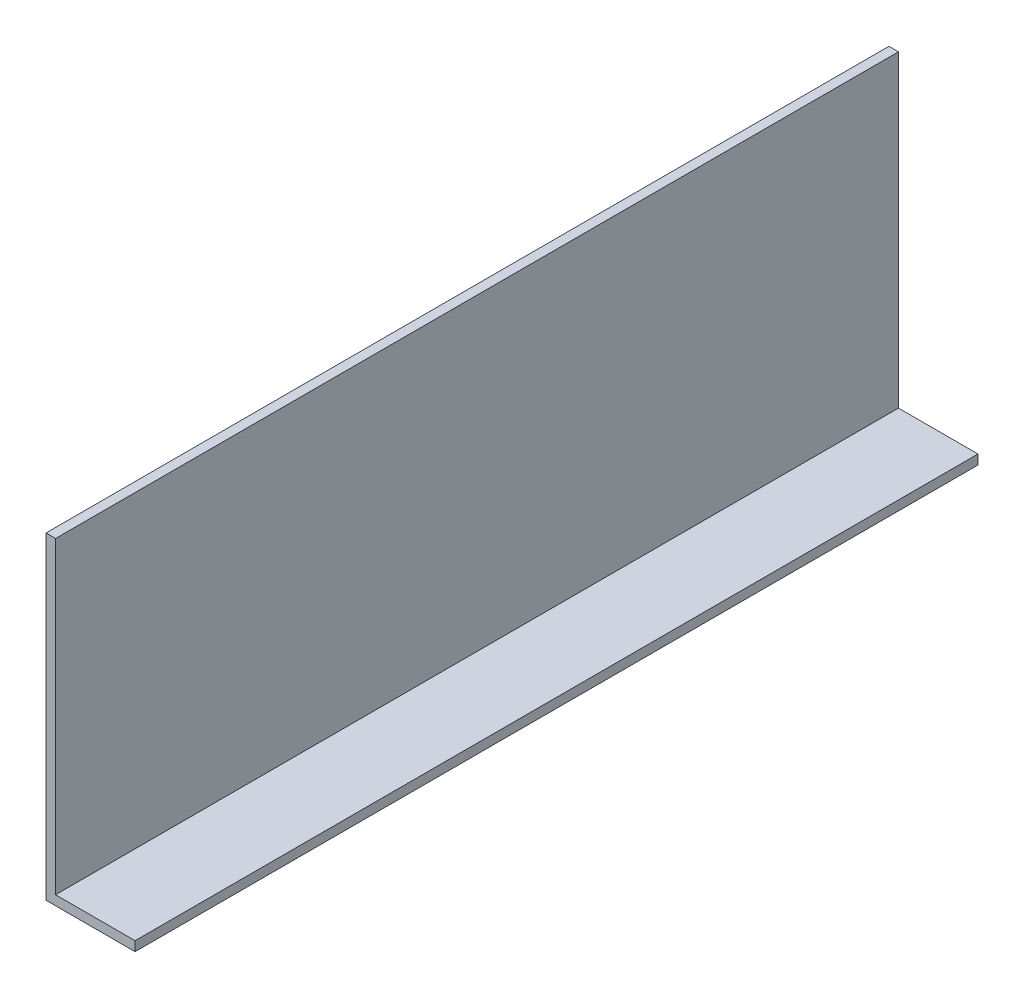
ISO-10303-21;
HEADER;
FILE_DESCRIPTION(('STEP AP214'),'2;1');
FILE_NAME('part.step','',(''),(''),'','','');
FILE_SCHEMA(('AUTOMOTIVE_DESIGN { 1 0 10303 214 1 1 1 1 }'));
ENDSEC;
DATA;
#1=APPLICATION_CONTEXT('core data for automotive mechanical design processes');
#2=APPLICATION_PROTOCOL_DEFINITION('international standard','automotive_design',2000,#1);
#3=PRODUCT_CONTEXT('',#1,'mechanical');
#4=PRODUCT('Part','Part','',(#3));
#5=PRODUCT_RELATED_PRODUCT_CATEGORY('part','',(#4));
#6=PRODUCT_DEFINITION_FORMATION('','',#4);
#7=PRODUCT_DEFINITION_CONTEXT('part definition',#1,'design');
#8=PRODUCT_DEFINITION('design','',#6,#7);
#9=PRODUCT_DEFINITION_SHAPE('','',#8);
#10=(LENGTH_UNIT() NAMED_UNIT(*) SI_UNIT(.MILLI.,.METRE.));
#11=(NAMED_UNIT(*) PLANE_ANGLE_UNIT() SI_UNIT($,.RADIAN.));
#12=(NAMED_UNIT(*) SI_UNIT($,.STERADIAN.) SOLID_ANGLE_UNIT());
#13=UNCERTAINTY_MEASURE_WITH_UNIT(LENGTH_MEASURE(1.E-05),#10,'distance_accuracy_value','');
#14=(GEOMETRIC_REPRESENTATION_CONTEXT(3) GLOBAL_UNCERTAINTY_ASSIGNED_CONTEXT((#13)) GLOBAL_UNIT_ASSIGNED_CONTEXT((#10,
#11,#12)) REPRESENTATION_CONTEXT('',''));
#15=CARTESIAN_POINT('',(0.,0.,0.));
#16=DIRECTION('',(0.,0.,1.));
#17=DIRECTION('',(1.,0.,0.));
#18=AXIS2_PLACEMENT_3D('',#15,#16,#17);
#19=CARTESIAN_POINT('',(3.,100.,265.));
#20=DIRECTION('',(0.,0.,-1.));
#21=DIRECTION('',(0.,1.,0.));
#22=AXIS2_PLACEMENT_3D('',#19,#20,#21);
#23=PLANE('',#22);
#24=DIRECTION('',(0.,-1.,0.));
#25=VECTOR('',#24,1.);
#26=CARTESIAN_POINT('',(-3.,100.,265.));
#27=LINE('',#26,#25);
#28=CARTESIAN_POINT('',(-3.,100.,265.));
#29=VERTEX_POINT('',#28);
#30=CARTESIAN_POINT('',(-3.,-100.,265.));
#31=VERTEX_POINT('',#30);
#32=EDGE_CURVE('E83',#29,#31,#27,.T.);
#33=ORIENTED_EDGE('',*,*,#32,.T.);
#34=DIRECTION('',(-1.,0.,0.));
#35=VECTOR('',#34,1.);
#36=CARTESIAN_POINT('',(3.,-100.,265.));
#37=LINE('',#36,#35);
#38=CARTESIAN_POINT('',(53.,-100.,265.));
#39=VERTEX_POINT('',#38);
#40=EDGE_CURVE('E11',#39,#31,#37,.T.);
#41=ORIENTED_EDGE('',*,*,#40,.F.);
#42=DIRECTION('',(0.,-1.,0.));
#43=VECTOR('',#42,1.);
#44=CARTESIAN_POINT('',(53.,-100.,265.));
#45=LINE('',#44,#43);
#46=CARTESIAN_POINT('',(53.,-94.,265.));
#47=VERTEX_POINT('',#46);
#48=EDGE_CURVE('E142',#47,#39,#45,.T.);
#49=ORIENTED_EDGE('',*,*,#48,.F.);
#50=DIRECTION('',(-1.,0.,0.));
#51=VECTOR('',#50,1.);
#52=CARTESIAN_POINT('',(53.,-94.,265.));
#53=LINE('',#52,#51);
#54=CARTESIAN_POINT('',(3.,-94.,265.));
#55=VERTEX_POINT('',#54);
#56=EDGE_CURVE('E136',#47,#55,#53,.T.);
#57=ORIENTED_EDGE('',*,*,#56,.T.);
#58=DIRECTION('',(0.,-1.,0.));
#59=VECTOR('',#58,1.);
#60=CARTESIAN_POINT('',(3.,100.,265.));
#61=LINE('',#60,#59);
#62=CARTESIAN_POINT('',(3.,100.,265.));
#63=VERTEX_POINT('',#62);
#64=EDGE_CURVE('E85',#63,#55,#61,.T.);
#65=ORIENTED_EDGE('',*,*,#64,.F.);
#66=DIRECTION('',(-1.,0.,0.));
#67=VECTOR('',#66,1.);
#68=CARTESIAN_POINT('',(3.,100.,265.));
#69=LINE('',#68,#67);
#70=EDGE_CURVE('E63',#63,#29,#69,.T.);
#71=ORIENTED_EDGE('',*,*,#70,.T.);
#72=EDGE_LOOP('',(#33,#41,#49,#57,#65,#71));
#73=FACE_BOUND('',#72,.T.);
#74=ADVANCED_FACE('F39',(#73),#23,.F.);
#75=CARTESIAN_POINT('',(3.,-100.,265.));
#76=DIRECTION('',(0.,1.,0.));
#77=DIRECTION('',(0.,0.,1.));
#78=AXIS2_PLACEMENT_3D('',#75,#76,#77);
#79=PLANE('',#78);
#80=DIRECTION('',(0.,0.,-1.));
#81=VECTOR('',#80,1.);
#82=CARTESIAN_POINT('',(-3.,-100.,265.));
#83=LINE('',#82,#81);
#84=CARTESIAN_POINT('',(-3.,-100.,-265.));
#85=VERTEX_POINT('',#84);
#86=EDGE_CURVE('E97',#31,#85,#83,.T.);
#87=ORIENTED_EDGE('',*,*,#86,.T.);
#88=DIRECTION('',(-1.,0.,0.));
#89=VECTOR('',#88,1.);
#90=CARTESIAN_POINT('',(3.,-100.,-265.));
#91=LINE('',#90,#89);
#92=CARTESIAN_POINT('',(53.,-100.,-265.));
#93=VERTEX_POINT('',#92);
#94=EDGE_CURVE('E47',#93,#85,#91,.T.);
#95=ORIENTED_EDGE('',*,*,#94,.F.);
#96=DIRECTION('',(0.,0.,-1.));
#97=VECTOR('',#96,1.);
#98=CARTESIAN_POINT('',(53.,-100.,265.));
#99=LINE('',#98,#97);
#100=EDGE_CURVE('E148',#39,#93,#99,.T.);
#101=ORIENTED_EDGE('',*,*,#100,.F.);
#102=ORIENTED_EDGE('',*,*,#40,.T.);
#103=EDGE_LOOP('',(#87,#95,#101,#102));
#104=FACE_BOUND('',#103,.T.);
#105=ADVANCED_FACE('F126',(#104),#79,.F.);
#106=CARTESIAN_POINT('',(3.,100.,-265.));
#107=DIRECTION('',(0.,0.,-1.));
#108=DIRECTION('',(0.,1.,0.));
#109=AXIS2_PLACEMENT_3D('',#106,#107,#108);
#110=PLANE('',#109);
#111=DIRECTION('',(0.,-1.,0.));
#112=VECTOR('',#111,1.);
#113=CARTESIAN_POINT('',(-3.,100.,-265.));
#114=LINE('',#113,#112);
#115=CARTESIAN_POINT('',(-3.,100.,-265.));
#116=VERTEX_POINT('',#115);
#117=EDGE_CURVE('E104',#116,#85,#114,.T.);
#118=ORIENTED_EDGE('',*,*,#117,.F.);
#119=DIRECTION('',(-1.,0.,0.));
#120=VECTOR('',#119,1.);
#121=CARTESIAN_POINT('',(3.,100.,-265.));
#122=LINE('',#121,#120);
#123=CARTESIAN_POINT('',(3.,100.,-265.));
#124=VERTEX_POINT('',#123);
#125=EDGE_CURVE('E88',#124,#116,#122,.T.);
#126=ORIENTED_EDGE('',*,*,#125,.F.);
#127=DIRECTION('',(0.,-1.,0.));
#128=VECTOR('',#127,1.);
#129=CARTESIAN_POINT('',(3.,100.,-265.));
#130=LINE('',#129,#128);
#131=CARTESIAN_POINT('',(3.,-94.,-265.));
#132=VERTEX_POINT('',#131);
#133=EDGE_CURVE('E108',#124,#132,#130,.T.);
#134=ORIENTED_EDGE('',*,*,#133,.T.);
#135=DIRECTION('',(-1.,0.,0.));
#136=VECTOR('',#135,1.);
#137=CARTESIAN_POINT('',(53.,-94.,-265.));
#138=LINE('',#137,#136);
#139=CARTESIAN_POINT('',(53.,-94.,-265.));
#140=VERTEX_POINT('',#139);
#141=EDGE_CURVE('E99',#140,#132,#138,.T.);
#142=ORIENTED_EDGE('',*,*,#141,.F.);
#143=DIRECTION('',(0.,1.,0.));
#144=VECTOR('',#143,1.);
#145=CARTESIAN_POINT('',(53.,-100.,-265.));
#146=LINE('',#145,#144);
#147=EDGE_CURVE('E122',#93,#140,#146,.T.);
#148=ORIENTED_EDGE('',*,*,#147,.F.);
#149=ORIENTED_EDGE('',*,*,#94,.T.);
#150=EDGE_LOOP('',(#118,#126,#134,#142,#148,#149));
#151=FACE_BOUND('',#150,.T.);
#152=ADVANCED_FACE('F118',(#151),#110,.T.);
#153=CARTESIAN_POINT('',(3.,100.,265.));
#154=DIRECTION('',(0.,1.,0.));
#155=DIRECTION('',(0.,0.,1.));
#156=AXIS2_PLACEMENT_3D('',#153,#154,#155);
#157=PLANE('',#156);
#158=DIRECTION('',(0.,0.,-1.));
#159=VECTOR('',#158,1.);
#160=CARTESIAN_POINT('',(-3.,100.,265.));
#161=LINE('',#160,#159);
#162=EDGE_CURVE('E95',#29,#116,#161,.T.);
#163=ORIENTED_EDGE('',*,*,#162,.F.);
#164=ORIENTED_EDGE('',*,*,#70,.F.);
#165=DIRECTION('',(0.,0.,-1.));
#166=VECTOR('',#165,1.);
#167=CARTESIAN_POINT('',(3.,100.,265.));
#168=LINE('',#167,#166);
#169=EDGE_CURVE('E89',#63,#124,#168,.T.);
#170=ORIENTED_EDGE('',*,*,#169,.T.);
#171=ORIENTED_EDGE('',*,*,#125,.T.);
#172=EDGE_LOOP('',(#163,#164,#170,#171));
#173=FACE_BOUND('',#172,.T.);
#174=ADVANCED_FACE('F101',(#173),#157,.T.);
#175=CARTESIAN_POINT('',(3.,0.,0.));
#176=DIRECTION('',(1.,0.,0.));
#177=DIRECTION('',(0.,0.,-1.));
#178=AXIS2_PLACEMENT_3D('',#175,#176,#177);
#179=PLANE('',#178);
#180=DIRECTION('',(0.,0.,1.));
#181=VECTOR('',#180,1.);
#182=CARTESIAN_POINT('',(3.,-94.,265.));
#183=LINE('',#182,#181);
#184=EDGE_CURVE('E54',#132,#55,#183,.T.);
#185=ORIENTED_EDGE('',*,*,#184,.F.);
#186=ORIENTED_EDGE('',*,*,#133,.F.);
#187=ORIENTED_EDGE('',*,*,#169,.F.);
#188=ORIENTED_EDGE('',*,*,#64,.T.);
#189=EDGE_LOOP('',(#185,#186,#187,#188));
#190=FACE_BOUND('',#189,.T.);
#191=ADVANCED_FACE('F165',(#190),#179,.T.);
#192=CARTESIAN_POINT('',(-3.,0.,0.));
#193=DIRECTION('',(1.,0.,0.));
#194=DIRECTION('',(0.,0.,-1.));
#195=AXIS2_PLACEMENT_3D('',#192,#193,#194);
#196=PLANE('',#195);
#197=ORIENTED_EDGE('',*,*,#32,.F.);
#198=ORIENTED_EDGE('',*,*,#162,.T.);
#199=ORIENTED_EDGE('',*,*,#117,.T.);
#200=ORIENTED_EDGE('',*,*,#86,.F.);
#201=EDGE_LOOP('',(#197,#198,#199,#200));
#202=FACE_BOUND('',#201,.T.);
#203=ADVANCED_FACE('F93',(#202),#196,.F.);
#204=CARTESIAN_POINT('',(53.,-94.,265.));
#205=DIRECTION('',(0.,-1.,0.));
#206=DIRECTION('',(0.,0.,-1.));
#207=AXIS2_PLACEMENT_3D('',#204,#205,#206);
#208=PLANE('',#207);
#209=ORIENTED_EDGE('',*,*,#184,.T.);
#210=ORIENTED_EDGE('',*,*,#56,.F.);
#211=DIRECTION('',(0.,0.,1.));
#212=VECTOR('',#211,1.);
#213=CARTESIAN_POINT('',(53.,-94.,265.));
#214=LINE('',#213,#212);
#215=EDGE_CURVE('E139',#140,#47,#214,.T.);
#216=ORIENTED_EDGE('',*,*,#215,.F.);
#217=ORIENTED_EDGE('',*,*,#141,.T.);
#218=EDGE_LOOP('',(#209,#210,#216,#217));
#219=FACE_BOUND('',#218,.T.);
#220=ADVANCED_FACE('F167',(#219),#208,.F.);
#221=CARTESIAN_POINT('',(53.,0.,0.));
#222=DIRECTION('',(-1.,0.,0.));
#223=DIRECTION('',(0.,0.,1.));
#224=AXIS2_PLACEMENT_3D('',#221,#222,#223);
#225=PLANE('',#224);
#226=ORIENTED_EDGE('',*,*,#48,.T.);
#227=ORIENTED_EDGE('',*,*,#100,.T.);
#228=ORIENTED_EDGE('',*,*,#147,.T.);
#229=ORIENTED_EDGE('',*,*,#215,.T.);
#230=EDGE_LOOP('',(#226,#227,#228,#229));
#231=FACE_BOUND('',#230,.T.);
#232=ADVANCED_FACE('F156',(#231),#225,.F.);
#233=CLOSED_SHELL('',(#74,#105,#152,#174,#191,#203,#220,#232));
#234=MANIFOLD_SOLID_BREP('B2',#233);
#235=ADVANCED_BREP_SHAPE_REPRESENTATION('',(#18,#234),#14);
#236=SHAPE_DEFINITION_REPRESENTATION(#9,#235);
ENDSEC;
END-ISO-10303-21;
